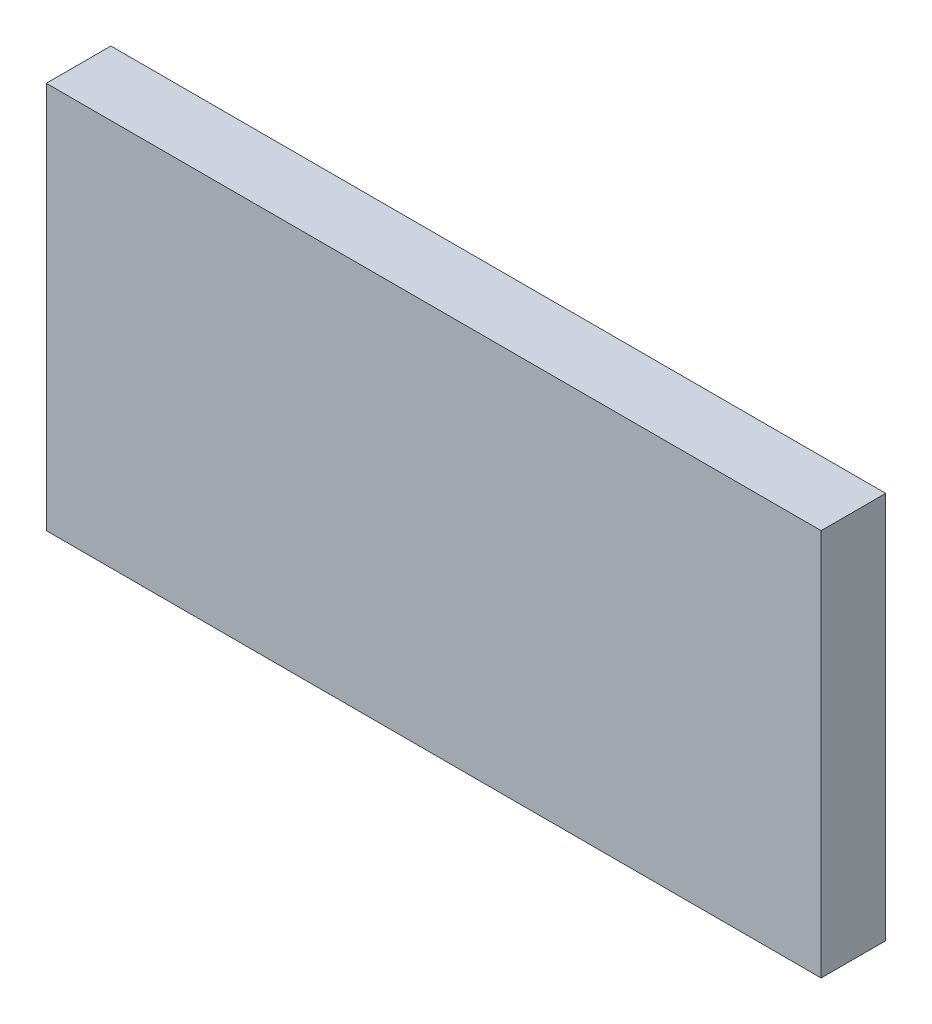
ISO-10303-21;
HEADER;
FILE_DESCRIPTION(('STEP AP214'),'2;1');
FILE_NAME('part.step','',(''),(''),'','','');
FILE_SCHEMA(('AUTOMOTIVE_DESIGN { 1 0 10303 214 1 1 1 1 }'));
ENDSEC;
DATA;
#1=APPLICATION_CONTEXT('core data for automotive mechanical design processes');
#2=APPLICATION_PROTOCOL_DEFINITION('international standard','automotive_design',2000,#1);
#3=PRODUCT_CONTEXT('',#1,'mechanical');
#4=PRODUCT('Part','Part','',(#3));
#5=PRODUCT_RELATED_PRODUCT_CATEGORY('part','',(#4));
#6=PRODUCT_DEFINITION_FORMATION('','',#4);
#7=PRODUCT_DEFINITION_CONTEXT('part definition',#1,'design');
#8=PRODUCT_DEFINITION('design','',#6,#7);
#9=PRODUCT_DEFINITION_SHAPE('','',#8);
#10=(LENGTH_UNIT() NAMED_UNIT(*) SI_UNIT(.MILLI.,.METRE.));
#11=(NAMED_UNIT(*) PLANE_ANGLE_UNIT() SI_UNIT($,.RADIAN.));
#12=(NAMED_UNIT(*) SI_UNIT($,.STERADIAN.) SOLID_ANGLE_UNIT());
#13=UNCERTAINTY_MEASURE_WITH_UNIT(LENGTH_MEASURE(1.E-05),#10,'distance_accuracy_value','');
#14=(GEOMETRIC_REPRESENTATION_CONTEXT(3) GLOBAL_UNCERTAINTY_ASSIGNED_CONTEXT((#13)) GLOBAL_UNIT_ASSIGNED_CONTEXT((#10,
#11,#12)) REPRESENTATION_CONTEXT('',''));
#15=CARTESIAN_POINT('',(0.,0.,0.));
#16=DIRECTION('',(0.,0.,1.));
#17=DIRECTION('',(1.,0.,0.));
#18=AXIS2_PLACEMENT_3D('',#15,#16,#17);
#19=CARTESIAN_POINT('',(38.1,-19.05,6.35));
#20=DIRECTION('',(-1.,0.,0.));
#21=DIRECTION('',(0.,0.,1.));
#22=AXIS2_PLACEMENT_3D('',#19,#20,#21);
#23=PLANE('',#22);
#24=DIRECTION('',(0.,1.,0.));
#25=VECTOR('',#24,1.);
#26=CARTESIAN_POINT('',(38.1,-19.05,0.));
#27=LINE('',#26,#25);
#28=CARTESIAN_POINT('',(38.1,-19.05,0.));
#29=VERTEX_POINT('',#28);
#30=CARTESIAN_POINT('',(38.1,19.05,0.));
#31=VERTEX_POINT('',#30);
#32=EDGE_CURVE('E107',#29,#31,#27,.T.);
#33=ORIENTED_EDGE('',*,*,#32,.T.);
#34=DIRECTION('',(0.,0.,-1.));
#35=VECTOR('',#34,1.);
#36=CARTESIAN_POINT('',(38.1,19.05,6.35));
#37=LINE('',#36,#35);
#38=CARTESIAN_POINT('',(38.1,19.05,6.35));
#39=VERTEX_POINT('',#38);
#40=EDGE_CURVE('E11',#39,#31,#37,.T.);
#41=ORIENTED_EDGE('',*,*,#40,.F.);
#42=DIRECTION('',(0.,1.,0.));
#43=VECTOR('',#42,1.);
#44=CARTESIAN_POINT('',(38.1,-19.05,6.35));
#45=LINE('',#44,#43);
#46=CARTESIAN_POINT('',(38.1,-19.05,6.35));
#47=VERTEX_POINT('',#46);
#48=EDGE_CURVE('E91',#47,#39,#45,.T.);
#49=ORIENTED_EDGE('',*,*,#48,.F.);
#50=DIRECTION('',(0.,0.,-1.));
#51=VECTOR('',#50,1.);
#52=CARTESIAN_POINT('',(38.1,-19.05,6.35));
#53=LINE('',#52,#51);
#54=EDGE_CURVE('E103',#47,#29,#53,.T.);
#55=ORIENTED_EDGE('',*,*,#54,.T.);
#56=EDGE_LOOP('',(#33,#41,#49,#55));
#57=FACE_BOUND('',#56,.T.);
#58=ADVANCED_FACE('F39',(#57),#23,.F.);
#59=CARTESIAN_POINT('',(-38.1,19.05,6.35));
#60=DIRECTION('',(0.,-1.,0.));
#61=DIRECTION('',(0.,0.,-1.));
#62=AXIS2_PLACEMENT_3D('',#59,#60,#61);
#63=PLANE('',#62);
#64=DIRECTION('',(-1.,0.,0.));
#65=VECTOR('',#64,1.);
#66=CARTESIAN_POINT('',(-38.1,19.05,0.));
#67=LINE('',#66,#65);
#68=CARTESIAN_POINT('',(-38.1,19.05,0.));
#69=VERTEX_POINT('',#68);
#70=EDGE_CURVE('E96',#31,#69,#67,.T.);
#71=ORIENTED_EDGE('',*,*,#70,.T.);
#72=DIRECTION('',(0.,0.,-1.));
#73=VECTOR('',#72,1.);
#74=CARTESIAN_POINT('',(-38.1,19.05,6.35));
#75=LINE('',#74,#73);
#76=CARTESIAN_POINT('',(-38.1,19.05,6.35));
#77=VERTEX_POINT('',#76);
#78=EDGE_CURVE('E48',#77,#69,#75,.T.);
#79=ORIENTED_EDGE('',*,*,#78,.F.);
#80=DIRECTION('',(-1.,0.,0.));
#81=VECTOR('',#80,1.);
#82=CARTESIAN_POINT('',(-38.1,19.05,6.35));
#83=LINE('',#82,#81);
#84=EDGE_CURVE('E86',#39,#77,#83,.T.);
#85=ORIENTED_EDGE('',*,*,#84,.F.);
#86=ORIENTED_EDGE('',*,*,#40,.T.);
#87=EDGE_LOOP('',(#71,#79,#85,#86));
#88=FACE_BOUND('',#87,.T.);
#89=ADVANCED_FACE('F95',(#88),#63,.F.);
#90=CARTESIAN_POINT('',(-38.1,-19.05,6.35));
#91=DIRECTION('',(1.,0.,0.));
#92=DIRECTION('',(0.,0.,-1.));
#93=AXIS2_PLACEMENT_3D('',#90,#91,#92);
#94=PLANE('',#93);
#95=DIRECTION('',(0.,-1.,0.));
#96=VECTOR('',#95,1.);
#97=CARTESIAN_POINT('',(-38.1,-19.05,0.));
#98=LINE('',#97,#96);
#99=CARTESIAN_POINT('',(-38.1,-19.05,0.));
#100=VERTEX_POINT('',#99);
#101=EDGE_CURVE('E73',#69,#100,#98,.T.);
#102=ORIENTED_EDGE('',*,*,#101,.T.);
#103=DIRECTION('',(0.,0.,-1.));
#104=VECTOR('',#103,1.);
#105=CARTESIAN_POINT('',(-38.1,-19.05,6.35));
#106=LINE('',#105,#104);
#107=CARTESIAN_POINT('',(-38.1,-19.05,6.35));
#108=VERTEX_POINT('',#107);
#109=EDGE_CURVE('E98',#108,#100,#106,.T.);
#110=ORIENTED_EDGE('',*,*,#109,.F.);
#111=DIRECTION('',(0.,-1.,0.));
#112=VECTOR('',#111,1.);
#113=CARTESIAN_POINT('',(-38.1,-19.05,6.35));
#114=LINE('',#113,#112);
#115=EDGE_CURVE('E89',#77,#108,#114,.T.);
#116=ORIENTED_EDGE('',*,*,#115,.F.);
#117=ORIENTED_EDGE('',*,*,#78,.T.);
#118=EDGE_LOOP('',(#102,#110,#116,#117));
#119=FACE_BOUND('',#118,.T.);
#120=ADVANCED_FACE('F99',(#119),#94,.F.);
#121=CARTESIAN_POINT('',(-38.1,-19.05,6.35));
#122=DIRECTION('',(0.,1.,0.));
#123=DIRECTION('',(0.,0.,1.));
#124=AXIS2_PLACEMENT_3D('',#121,#122,#123);
#125=PLANE('',#124);
#126=DIRECTION('',(1.,0.,0.));
#127=VECTOR('',#126,1.);
#128=CARTESIAN_POINT('',(-38.1,-19.05,0.));
#129=LINE('',#128,#127);
#130=EDGE_CURVE('E79',#100,#29,#129,.T.);
#131=ORIENTED_EDGE('',*,*,#130,.T.);
#132=ORIENTED_EDGE('',*,*,#54,.F.);
#133=DIRECTION('',(1.,0.,0.));
#134=VECTOR('',#133,1.);
#135=CARTESIAN_POINT('',(-38.1,-19.05,6.35));
#136=LINE('',#135,#134);
#137=EDGE_CURVE('E56',#108,#47,#136,.T.);
#138=ORIENTED_EDGE('',*,*,#137,.F.);
#139=ORIENTED_EDGE('',*,*,#109,.T.);
#140=EDGE_LOOP('',(#131,#132,#138,#139));
#141=FACE_BOUND('',#140,.T.);
#142=ADVANCED_FACE('F120',(#141),#125,.F.);
#143=CARTESIAN_POINT('',(0.,0.,6.35));
#144=DIRECTION('',(0.,0.,-1.));
#145=DIRECTION('',(-1.,0.,0.));
#146=AXIS2_PLACEMENT_3D('',#143,#144,#145);
#147=PLANE('',#146);
#148=ORIENTED_EDGE('',*,*,#48,.T.);
#149=ORIENTED_EDGE('',*,*,#84,.T.);
#150=ORIENTED_EDGE('',*,*,#115,.T.);
#151=ORIENTED_EDGE('',*,*,#137,.T.);
#152=EDGE_LOOP('',(#148,#149,#150,#151));
#153=FACE_BOUND('',#152,.T.);
#154=ADVANCED_FACE('F87',(#153),#147,.F.);
#155=CARTESIAN_POINT('',(0.,0.,0.));
#156=DIRECTION('',(0.,0.,-1.));
#157=DIRECTION('',(-1.,0.,0.));
#158=AXIS2_PLACEMENT_3D('',#155,#156,#157);
#159=PLANE('',#158);
#160=ORIENTED_EDGE('',*,*,#32,.F.);
#161=ORIENTED_EDGE('',*,*,#130,.F.);
#162=ORIENTED_EDGE('',*,*,#101,.F.);
#163=ORIENTED_EDGE('',*,*,#70,.F.);
#164=EDGE_LOOP('',(#160,#161,#162,#163));
#165=FACE_BOUND('',#164,.T.);
#166=ADVANCED_FACE('F123',(#165),#159,.T.);
#167=CLOSED_SHELL('',(#58,#89,#120,#142,#154,#166));
#168=MANIFOLD_SOLID_BREP('B2',#167);
#169=ADVANCED_BREP_SHAPE_REPRESENTATION('',(#18,#168),#14);
#170=SHAPE_DEFINITION_REPRESENTATION(#9,#169);
ENDSEC;
END-ISO-10303-21;
